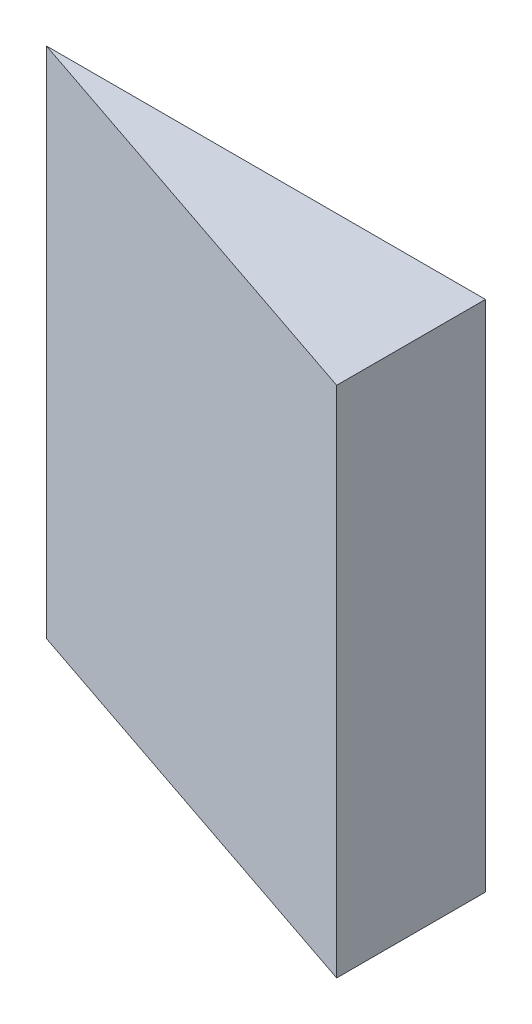
ISO-10303-21;
HEADER;
FILE_DESCRIPTION(('STEP AP214'),'2;1');
FILE_NAME('part.step','',(''),(''),'','','');
FILE_SCHEMA(('AUTOMOTIVE_DESIGN { 1 0 10303 214 1 1 1 1 }'));
ENDSEC;
DATA;
#1=APPLICATION_CONTEXT('core data for automotive mechanical design processes');
#2=APPLICATION_PROTOCOL_DEFINITION('international standard','automotive_design',2000,#1);
#3=PRODUCT_CONTEXT('',#1,'mechanical');
#4=PRODUCT('Part','Part','',(#3));
#5=PRODUCT_RELATED_PRODUCT_CATEGORY('part','',(#4));
#6=PRODUCT_DEFINITION_FORMATION('','',#4);
#7=PRODUCT_DEFINITION_CONTEXT('part definition',#1,'design');
#8=PRODUCT_DEFINITION('design','',#6,#7);
#9=PRODUCT_DEFINITION_SHAPE('','',#8);
#10=(LENGTH_UNIT() NAMED_UNIT(*) SI_UNIT(.MILLI.,.METRE.));
#11=(NAMED_UNIT(*) PLANE_ANGLE_UNIT() SI_UNIT($,.RADIAN.));
#12=(NAMED_UNIT(*) SI_UNIT($,.STERADIAN.) SOLID_ANGLE_UNIT());
#13=UNCERTAINTY_MEASURE_WITH_UNIT(LENGTH_MEASURE(1.E-05),#10,'distance_accuracy_value','');
#14=(GEOMETRIC_REPRESENTATION_CONTEXT(3) GLOBAL_UNCERTAINTY_ASSIGNED_CONTEXT((#13)) GLOBAL_UNIT_ASSIGNED_CONTEXT((#10,
#11,#12)) REPRESENTATION_CONTEXT('',''));
#15=CARTESIAN_POINT('',(0.,0.,0.));
#16=DIRECTION('',(0.,0.,1.));
#17=DIRECTION('',(1.,0.,0.));
#18=AXIS2_PLACEMENT_3D('',#15,#16,#17);
#19=CARTESIAN_POINT('',(-9.90288323187605,87.63,-34.1908451260969));
#20=DIRECTION('',(0.321039281157898,0.,-0.947065879415799));
#21=DIRECTION('',(-0.947065879415799,0.,-0.321039281157898));
#22=AXIS2_PLACEMENT_3D('',#19,#20,#21);
#23=PLANE('',#22);
#24=DIRECTION('',(0.947065879415799,0.,0.321039281157898));
#25=VECTOR('',#24,1.);
#26=CARTESIAN_POINT('',(-9.90288323187605,0.,-34.1908451260969));
#27=LINE('',#26,#25);
#28=CARTESIAN_POINT('',(-9.90288323187605,0.,-34.1908451260969));
#29=VERTEX_POINT('',#28);
#30=CARTESIAN_POINT('',(65.0271167681239,0.,-8.79084512609694));
#31=VERTEX_POINT('',#30);
#32=EDGE_CURVE('E75',#29,#31,#27,.T.);
#33=ORIENTED_EDGE('',*,*,#32,.T.);
#34=DIRECTION('',(0.,-1.,0.));
#35=VECTOR('',#34,1.);
#36=CARTESIAN_POINT('',(65.0271167681239,87.63,-8.79084512609694));
#37=LINE('',#36,#35);
#38=CARTESIAN_POINT('',(65.0271167681239,87.63,-8.79084512609694));
#39=VERTEX_POINT('',#38);
#40=EDGE_CURVE('E11',#39,#31,#37,.T.);
#41=ORIENTED_EDGE('',*,*,#40,.F.);
#42=DIRECTION('',(0.947065879415799,0.,0.321039281157898));
#43=VECTOR('',#42,1.);
#44=CARTESIAN_POINT('',(-9.90288323187605,87.63,-34.1908451260969));
#45=LINE('',#44,#43);
#46=CARTESIAN_POINT('',(-9.90288323187605,87.63,-34.1908451260969));
#47=VERTEX_POINT('',#46);
#48=EDGE_CURVE('E67',#47,#39,#45,.T.);
#49=ORIENTED_EDGE('',*,*,#48,.F.);
#50=DIRECTION('',(0.,-1.,0.));
#51=VECTOR('',#50,1.);
#52=CARTESIAN_POINT('',(-9.90288323187605,87.63,-34.1908451260969));
#53=LINE('',#52,#51);
#54=EDGE_CURVE('E49',#47,#29,#53,.T.);
#55=ORIENTED_EDGE('',*,*,#54,.T.);
#56=EDGE_LOOP('',(#33,#41,#49,#55));
#57=FACE_BOUND('',#56,.T.);
#58=ADVANCED_FACE('F33',(#57),#23,.F.);
#59=CARTESIAN_POINT('',(65.0271167681239,87.63,-34.1908451260969));
#60=DIRECTION('',(1.,0.,0.));
#61=DIRECTION('',(0.,0.,-1.));
#62=AXIS2_PLACEMENT_3D('',#59,#60,#61);
#63=PLANE('',#62);
#64=DIRECTION('',(0.,0.,1.));
#65=VECTOR('',#64,1.);
#66=CARTESIAN_POINT('',(65.0271167681239,0.,-34.1908451260969));
#67=LINE('',#66,#65);
#68=CARTESIAN_POINT('',(65.0271167681239,0.,-34.1908451260969));
#69=VERTEX_POINT('',#68);
#70=EDGE_CURVE('E83',#69,#31,#67,.T.);
#71=ORIENTED_EDGE('',*,*,#70,.F.);
#72=DIRECTION('',(0.,-1.,0.));
#73=VECTOR('',#72,1.);
#74=CARTESIAN_POINT('',(65.0271167681239,87.63,-34.1908451260969));
#75=LINE('',#74,#73);
#76=CARTESIAN_POINT('',(65.0271167681239,87.63,-34.1908451260969));
#77=VERTEX_POINT('',#76);
#78=EDGE_CURVE('E41',#77,#69,#75,.T.);
#79=ORIENTED_EDGE('',*,*,#78,.F.);
#80=DIRECTION('',(0.,0.,1.));
#81=VECTOR('',#80,1.);
#82=CARTESIAN_POINT('',(65.0271167681239,87.63,-34.1908451260969));
#83=LINE('',#82,#81);
#84=EDGE_CURVE('E71',#77,#39,#83,.T.);
#85=ORIENTED_EDGE('',*,*,#84,.T.);
#86=ORIENTED_EDGE('',*,*,#40,.T.);
#87=EDGE_LOOP('',(#71,#79,#85,#86));
#88=FACE_BOUND('',#87,.T.);
#89=ADVANCED_FACE('F78',(#88),#63,.T.);
#90=CARTESIAN_POINT('',(-9.90288323187605,87.63,-34.1908451260969));
#91=DIRECTION('',(0.,0.,-1.));
#92=DIRECTION('',(-1.,0.,0.));
#93=AXIS2_PLACEMENT_3D('',#90,#91,#92);
#94=PLANE('',#93);
#95=DIRECTION('',(1.,0.,0.));
#96=VECTOR('',#95,1.);
#97=CARTESIAN_POINT('',(-9.90288323187605,0.,-34.1908451260969));
#98=LINE('',#97,#96);
#99=EDGE_CURVE('E73',#29,#69,#98,.T.);
#100=ORIENTED_EDGE('',*,*,#99,.F.);
#101=ORIENTED_EDGE('',*,*,#54,.F.);
#102=DIRECTION('',(1.,0.,0.));
#103=VECTOR('',#102,1.);
#104=CARTESIAN_POINT('',(-9.90288323187605,87.63,-34.1908451260969));
#105=LINE('',#104,#103);
#106=EDGE_CURVE('E72',#47,#77,#105,.T.);
#107=ORIENTED_EDGE('',*,*,#106,.T.);
#108=ORIENTED_EDGE('',*,*,#78,.T.);
#109=EDGE_LOOP('',(#100,#101,#107,#108));
#110=FACE_BOUND('',#109,.T.);
#111=ADVANCED_FACE('F89',(#110),#94,.T.);
#112=CARTESIAN_POINT('',(0.,87.63,0.));
#113=DIRECTION('',(0.,-1.,0.));
#114=DIRECTION('',(0.,0.,-1.));
#115=AXIS2_PLACEMENT_3D('',#112,#113,#114);
#116=PLANE('',#115);
#117=ORIENTED_EDGE('',*,*,#48,.T.);
#118=ORIENTED_EDGE('',*,*,#84,.F.);
#119=ORIENTED_EDGE('',*,*,#106,.F.);
#120=EDGE_LOOP('',(#117,#118,#119));
#121=FACE_BOUND('',#120,.T.);
#122=ADVANCED_FACE('F69',(#121),#116,.F.);
#123=CARTESIAN_POINT('',(0.,0.,0.));
#124=DIRECTION('',(0.,-1.,0.));
#125=DIRECTION('',(0.,0.,-1.));
#126=AXIS2_PLACEMENT_3D('',#123,#124,#125);
#127=PLANE('',#126);
#128=ORIENTED_EDGE('',*,*,#32,.F.);
#129=ORIENTED_EDGE('',*,*,#99,.T.);
#130=ORIENTED_EDGE('',*,*,#70,.T.);
#131=EDGE_LOOP('',(#128,#129,#130));
#132=FACE_BOUND('',#131,.T.);
#133=ADVANCED_FACE('F88',(#132),#127,.T.);
#134=CLOSED_SHELL('',(#58,#89,#111,#122,#133));
#135=MANIFOLD_SOLID_BREP('B2',#134);
#136=ADVANCED_BREP_SHAPE_REPRESENTATION('',(#18,#135),#14);
#137=SHAPE_DEFINITION_REPRESENTATION(#9,#136);
ENDSEC;
END-ISO-10303-21;
